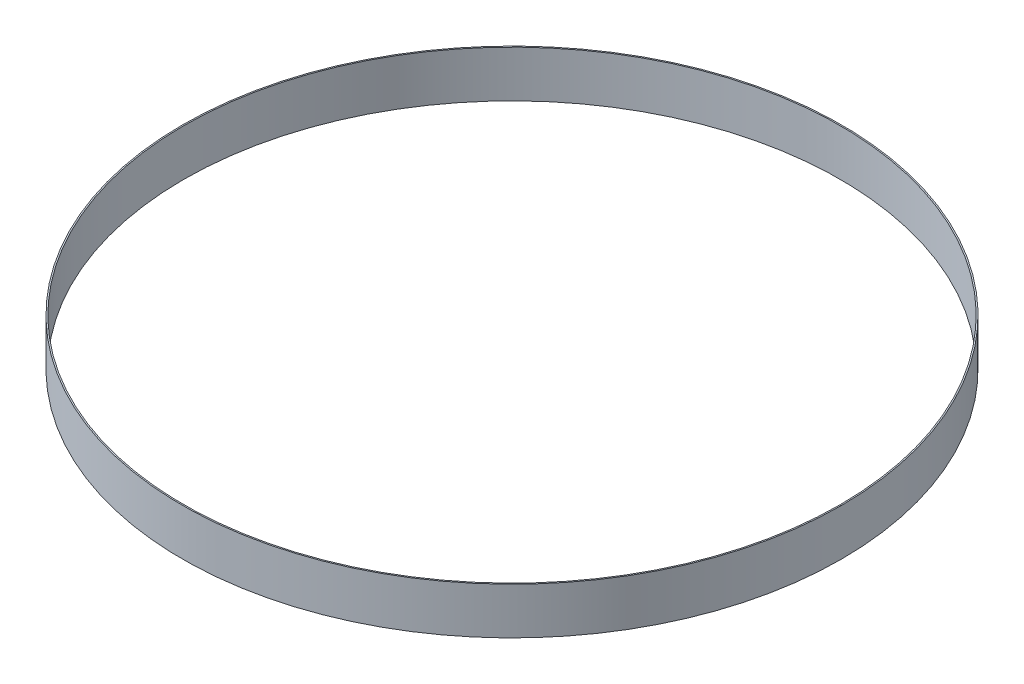
ISO-10303-21;
HEADER;
FILE_DESCRIPTION(('STEP AP214'),'2;1');
FILE_NAME('part.step','',(''),(''),'','','');
FILE_SCHEMA(('AUTOMOTIVE_DESIGN { 1 0 10303 214 1 1 1 1 }'));
ENDSEC;
DATA;
#1=APPLICATION_CONTEXT('core data for automotive mechanical design processes');
#2=APPLICATION_PROTOCOL_DEFINITION('international standard','automotive_design',2000,#1);
#3=PRODUCT_CONTEXT('',#1,'mechanical');
#4=PRODUCT('Part','Part','',(#3));
#5=PRODUCT_RELATED_PRODUCT_CATEGORY('part','',(#4));
#6=PRODUCT_DEFINITION_FORMATION('','',#4);
#7=PRODUCT_DEFINITION_CONTEXT('part definition',#1,'design');
#8=PRODUCT_DEFINITION('design','',#6,#7);
#9=PRODUCT_DEFINITION_SHAPE('','',#8);
#10=(LENGTH_UNIT() NAMED_UNIT(*) SI_UNIT(.MILLI.,.METRE.));
#11=(NAMED_UNIT(*) PLANE_ANGLE_UNIT() SI_UNIT($,.RADIAN.));
#12=(NAMED_UNIT(*) SI_UNIT($,.STERADIAN.) SOLID_ANGLE_UNIT());
#13=UNCERTAINTY_MEASURE_WITH_UNIT(LENGTH_MEASURE(1.E-05),#10,'distance_accuracy_value','');
#14=(GEOMETRIC_REPRESENTATION_CONTEXT(3) GLOBAL_UNCERTAINTY_ASSIGNED_CONTEXT((#13)) GLOBAL_UNIT_ASSIGNED_CONTEXT((#10,
#11,#12)) REPRESENTATION_CONTEXT('',''));
#15=CARTESIAN_POINT('',(0.,0.,0.));
#16=DIRECTION('',(0.,0.,1.));
#17=DIRECTION('',(1.,0.,0.));
#18=AXIS2_PLACEMENT_3D('',#15,#16,#17);
#19=CARTESIAN_POINT('',(-1.11022302462516E-13,140.,-3.88686478836053E-13));
#20=DIRECTION('',(0.,1.,0.));
#21=DIRECTION('',(0.,0.,1.));
#22=AXIS2_PLACEMENT_3D('',#19,#20,#21);
#23=PLANE('',#22);
#24=DIRECTION('',(0.999999872847588,0.,0.000504286434695339));
#25=VECTOR('',#24,1.);
#26=CARTESIAN_POINT('',(991.499873928384,140.,0.500000000000041));
#27=LINE('',#26,#25);
#28=CARTESIAN_POINT('',(987.499874436993,140.,0.497982854261259));
#29=VERTEX_POINT('',#28);
#30=CARTESIAN_POINT('',(991.499873928384,140.,0.500000000000041));
#31=VERTEX_POINT('',#30);
#32=EDGE_CURVE('E11',#29,#31,#27,.T.);
#33=ORIENTED_EDGE('',*,*,#32,.F.);
#34=CARTESIAN_POINT('',(1.11022302462516E-13,140.,-3.88578058618805E-13));
#35=DIRECTION('',(0.,-1.,0.));
#36=DIRECTION('',(0.,0.,-1.));
#37=AXIS2_PLACEMENT_3D('',#34,#35,#36);
#38=CIRCLE('',#37,987.5);
#39=CARTESIAN_POINT('',(987.499874436993,140.,-0.497982854250536));
#40=VERTEX_POINT('',#39);
#41=EDGE_CURVE('E72',#29,#40,#38,.T.);
#42=ORIENTED_EDGE('',*,*,#41,.T.);
#43=DIRECTION('',(0.999999872847588,0.,-0.000504286434683694));
#44=VECTOR('',#43,1.);
#45=CARTESIAN_POINT('',(991.499873928384,140.,-0.499999999989271));
#46=LINE('',#45,#44);
#47=CARTESIAN_POINT('',(991.499873928384,140.,-0.499999999989271));
#48=VERTEX_POINT('',#47);
#49=EDGE_CURVE('E46',#40,#48,#46,.T.);
#50=ORIENTED_EDGE('',*,*,#49,.T.);
#51=CARTESIAN_POINT('',(-1.11022302462516E-13,140.,-3.88686478836053E-13));
#52=DIRECTION('',(0.,-1.,0.));
#53=DIRECTION('',(0.,0.,-1.));
#54=AXIS2_PLACEMENT_3D('',#51,#52,#53);
#55=CIRCLE('',#54,991.5);
#56=EDGE_CURVE('E75',#31,#48,#55,.T.);
#57=ORIENTED_EDGE('',*,*,#56,.F.);
#58=EDGE_LOOP('',(#33,#42,#50,#57));
#59=FACE_BOUND('',#58,.T.);
#60=ADVANCED_FACE('F36',(#59),#23,.T.);
#61=CARTESIAN_POINT('',(991.499873928384,69.9999999999998,-0.499999999989294));
#62=DIRECTION('',(0.000504286434683717,0.,0.999999872847588));
#63=DIRECTION('',(0.,-1.,0.));
#64=AXIS2_PLACEMENT_3D('',#61,#62,#63);
#65=PLANE('',#64);
#66=ORIENTED_EDGE('',*,*,#49,.F.);
#67=DIRECTION('',(0.,-1.,0.));
#68=VECTOR('',#67,1.);
#69=CARTESIAN_POINT('',(987.499874436993,6282.10028977282,-0.497982854250536));
#70=LINE('',#69,#68);
#71=CARTESIAN_POINT('',(987.499874436993,0.,-0.497982854250536));
#72=VERTEX_POINT('',#71);
#73=EDGE_CURVE('E87',#40,#72,#70,.T.);
#74=ORIENTED_EDGE('',*,*,#73,.T.);
#75=DIRECTION('',(0.999999872847588,0.,-0.000504286434683717));
#76=VECTOR('',#75,1.);
#77=CARTESIAN_POINT('',(991.499873928384,0.,-0.499999999989294));
#78=LINE('',#77,#76);
#79=CARTESIAN_POINT('',(991.499873928384,0.,-0.499999999989294));
#80=VERTEX_POINT('',#79);
#81=EDGE_CURVE('E96',#72,#80,#78,.T.);
#82=ORIENTED_EDGE('',*,*,#81,.T.);
#83=DIRECTION('',(0.,-1.,0.));
#84=VECTOR('',#83,1.);
#85=CARTESIAN_POINT('',(991.499873928384,140.,-0.499999999989294));
#86=LINE('',#85,#84);
#87=EDGE_CURVE('E91',#48,#80,#86,.T.);
#88=ORIENTED_EDGE('',*,*,#87,.F.);
#89=EDGE_LOOP('',(#66,#74,#82,#88));
#90=FACE_BOUND('',#89,.T.);
#91=ADVANCED_FACE('F104',(#90),#65,.T.);
#92=CARTESIAN_POINT('',(-1.11022302462516E-13,0.,-3.88686478836053E-13));
#93=DIRECTION('',(0.,-1.,0.));
#94=DIRECTION('',(0.,0.,-1.));
#95=AXIS2_PLACEMENT_3D('',#92,#93,#94);
#96=PLANE('',#95);
#97=ORIENTED_EDGE('',*,*,#81,.F.);
#98=CARTESIAN_POINT('',(1.11022302462516E-13,0.,-3.88578058618805E-13));
#99=DIRECTION('',(0.,-1.,0.));
#100=DIRECTION('',(0.,0.,-1.));
#101=AXIS2_PLACEMENT_3D('',#98,#99,#100);
#102=CIRCLE('',#101,987.5);
#103=CARTESIAN_POINT('',(987.499874436993,0.,0.497982854261259));
#104=VERTEX_POINT('',#103);
#105=EDGE_CURVE('E89',#72,#104,#102,.F.);
#106=ORIENTED_EDGE('',*,*,#105,.T.);
#107=DIRECTION('',(0.999999872847588,0.,0.00050428643469524));
#108=VECTOR('',#107,1.);
#109=CARTESIAN_POINT('',(991.499873928384,0.,0.499999999999942));
#110=LINE('',#109,#108);
#111=CARTESIAN_POINT('',(991.499873928384,0.,0.499999999999942));
#112=VERTEX_POINT('',#111);
#113=EDGE_CURVE('E40',#104,#112,#110,.T.);
#114=ORIENTED_EDGE('',*,*,#113,.T.);
#115=CARTESIAN_POINT('',(-1.11022302462516E-13,0.,-3.88686478836053E-13));
#116=DIRECTION('',(0.,1.,0.));
#117=DIRECTION('',(0.,0.,1.));
#118=AXIS2_PLACEMENT_3D('',#115,#116,#117);
#119=CIRCLE('',#118,991.5);
#120=EDGE_CURVE('E105',#80,#112,#119,.T.);
#121=ORIENTED_EDGE('',*,*,#120,.F.);
#122=EDGE_LOOP('',(#97,#106,#114,#121));
#123=FACE_BOUND('',#122,.T.);
#124=ADVANCED_FACE('F109',(#123),#96,.T.);
#125=CARTESIAN_POINT('',(991.499873928384,69.9999999999998,0.500000000000041));
#126=DIRECTION('',(0.00050428643469534,0.,-0.999999872847588));
#127=DIRECTION('',(0.,1.,0.));
#128=AXIS2_PLACEMENT_3D('',#125,#126,#127);
#129=PLANE('',#128);
#130=DIRECTION('',(0.,-1.,0.));
#131=VECTOR('',#130,1.);
#132=CARTESIAN_POINT('',(987.499874436993,6282.10028977282,0.497982854261259));
#133=LINE('',#132,#131);
#134=EDGE_CURVE('E85',#104,#29,#133,.F.);
#135=ORIENTED_EDGE('',*,*,#134,.T.);
#136=ORIENTED_EDGE('',*,*,#32,.T.);
#137=DIRECTION('',(0.,1.,0.));
#138=VECTOR('',#137,1.);
#139=CARTESIAN_POINT('',(991.499873928384,0.,0.500000000000041));
#140=LINE('',#139,#138);
#141=EDGE_CURVE('E103',#112,#31,#140,.T.);
#142=ORIENTED_EDGE('',*,*,#141,.F.);
#143=ORIENTED_EDGE('',*,*,#113,.F.);
#144=EDGE_LOOP('',(#135,#136,#142,#143));
#145=FACE_BOUND('',#144,.T.);
#146=ADVANCED_FACE('F38',(#145),#129,.T.);
#147=CARTESIAN_POINT('',(1.11022302462516E-13,6282.10028977282,-3.88578058618805E-13));
#148=DIRECTION('',(0.,-1.,0.));
#149=DIRECTION('',(0.,0.,-1.));
#150=AXIS2_PLACEMENT_3D('',#147,#148,#149);
#151=CYLINDRICAL_SURFACE('',#150,991.5);
#152=ORIENTED_EDGE('',*,*,#120,.T.);
#153=ORIENTED_EDGE('',*,*,#141,.T.);
#154=ORIENTED_EDGE('',*,*,#56,.T.);
#155=ORIENTED_EDGE('',*,*,#87,.T.);
#156=EDGE_LOOP('',(#152,#153,#154,#155));
#157=FACE_BOUND('',#156,.T.);
#158=ADVANCED_FACE('F102',(#157),#151,.T.);
#159=CARTESIAN_POINT('',(1.11022302462516E-13,6282.10028977282,-3.88578058618805E-13));
#160=DIRECTION('',(0.,-1.,0.));
#161=DIRECTION('',(0.,0.,-1.));
#162=AXIS2_PLACEMENT_3D('',#159,#160,#161);
#163=CYLINDRICAL_SURFACE('',#162,987.5);
#164=ORIENTED_EDGE('',*,*,#105,.F.);
#165=ORIENTED_EDGE('',*,*,#73,.F.);
#166=ORIENTED_EDGE('',*,*,#41,.F.);
#167=ORIENTED_EDGE('',*,*,#134,.F.);
#168=EDGE_LOOP('',(#164,#165,#166,#167));
#169=FACE_BOUND('',#168,.T.);
#170=ADVANCED_FACE('F84',(#169),#163,.F.);
#171=CLOSED_SHELL('',(#60,#91,#124,#146,#158,#170));
#172=MANIFOLD_SOLID_BREP('B2',#171);
#173=ADVANCED_BREP_SHAPE_REPRESENTATION('',(#18,#172),#14);
#174=SHAPE_DEFINITION_REPRESENTATION(#9,#173);
ENDSEC;
END-ISO-10303-21;
